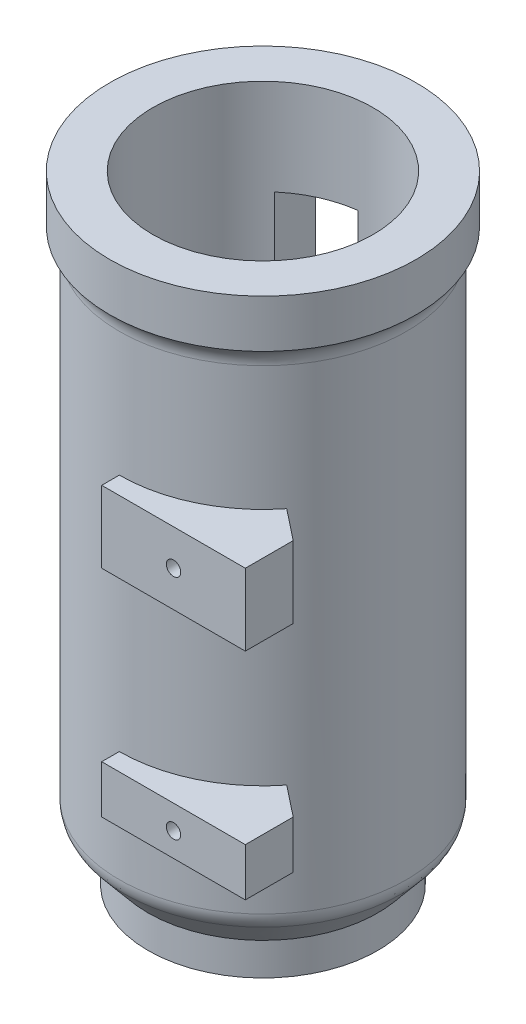
ISO-10303-21;
HEADER;
FILE_DESCRIPTION(('STEP AP214'),'2;1');
FILE_NAME('part.step','',(''),(''),'','','');
FILE_SCHEMA(('AUTOMOTIVE_DESIGN { 1 0 10303 214 1 1 1 1 }'));
ENDSEC;
DATA;
#1=APPLICATION_CONTEXT('core data for automotive mechanical design processes');
#2=APPLICATION_PROTOCOL_DEFINITION('international standard','automotive_design',2000,#1);
#3=PRODUCT_CONTEXT('',#1,'mechanical');
#4=PRODUCT('Part','Part','',(#3));
#5=PRODUCT_RELATED_PRODUCT_CATEGORY('part','',(#4));
#6=PRODUCT_DEFINITION_FORMATION('','',#4);
#7=PRODUCT_DEFINITION_CONTEXT('part definition',#1,'design');
#8=PRODUCT_DEFINITION('design','',#6,#7);
#9=PRODUCT_DEFINITION_SHAPE('','',#8);
#10=(LENGTH_UNIT() NAMED_UNIT(*) SI_UNIT(.MILLI.,.METRE.));
#11=(NAMED_UNIT(*) PLANE_ANGLE_UNIT() SI_UNIT($,.RADIAN.));
#12=(NAMED_UNIT(*) SI_UNIT($,.STERADIAN.) SOLID_ANGLE_UNIT());
#13=UNCERTAINTY_MEASURE_WITH_UNIT(LENGTH_MEASURE(1.E-05),#10,'distance_accuracy_value','');
#14=(GEOMETRIC_REPRESENTATION_CONTEXT(3) GLOBAL_UNCERTAINTY_ASSIGNED_CONTEXT((#13)) GLOBAL_UNIT_ASSIGNED_CONTEXT((#10,
#11,#12)) REPRESENTATION_CONTEXT('',''));
#15=CARTESIAN_POINT('',(0.,0.,0.));
#16=DIRECTION('',(0.,0.,1.));
#17=DIRECTION('',(1.,0.,0.));
#18=AXIS2_PLACEMENT_3D('',#15,#16,#17);
#19=CARTESIAN_POINT('',(0.,114.,0.));
#20=DIRECTION('',(0.,-1.,0.));
#21=DIRECTION('',(0.,0.,-1.));
#22=AXIS2_PLACEMENT_3D('',#19,#20,#21);
#23=CYLINDRICAL_SURFACE('',#22,30.);
#24=DIRECTION('',(0.,-1.,0.));
#25=VECTOR('',#24,1.);
#26=CARTESIAN_POINT('',(0.,34.,30.));
#27=LINE('',#26,#25);
#28=CARTESIAN_POINT('',(0.,34.,30.));
#29=VERTEX_POINT('',#28);
#30=CARTESIAN_POINT('',(0.,24.,30.));
#31=VERTEX_POINT('',#30);
#32=EDGE_CURVE('E56',#29,#31,#27,.T.);
#33=ORIENTED_EDGE('',*,*,#32,.F.);
#34=CARTESIAN_POINT('',(0.,34.,0.));
#35=DIRECTION('',(0.,-1.,0.));
#36=DIRECTION('',(0.,0.,1.));
#37=AXIS2_PLACEMENT_3D('',#34,#35,#36);
#38=CIRCLE('',#37,30.);
#39=CARTESIAN_POINT('',(23.5497514520521,34.,18.5851878265076));
#40=VERTEX_POINT('',#39);
#41=EDGE_CURVE('E51',#40,#29,#38,.T.);
#42=ORIENTED_EDGE('',*,*,#41,.F.);
#43=DIRECTION('',(0.,-1.,0.));
#44=VECTOR('',#43,1.);
#45=CARTESIAN_POINT('',(23.5497514520521,34.,18.5851878265076));
#46=LINE('',#45,#44);
#47=CARTESIAN_POINT('',(23.5497514520521,24.,18.5851878265076));
#48=VERTEX_POINT('',#47);
#49=EDGE_CURVE('E142',#40,#48,#46,.T.);
#50=ORIENTED_EDGE('',*,*,#49,.T.);
#51=CARTESIAN_POINT('',(0.,24.,0.));
#52=DIRECTION('',(0.,-1.,0.));
#53=DIRECTION('',(0.,0.,1.));
#54=AXIS2_PLACEMENT_3D('',#51,#52,#53);
#55=CIRCLE('',#54,30.);
#56=EDGE_CURVE('E421',#48,#31,#55,.T.);
#57=ORIENTED_EDGE('',*,*,#56,.T.);
#58=EDGE_LOOP('',(#33,#42,#50,#57));
#59=FACE_BOUND('',#58,.T.);
#60=CARTESIAN_POINT('',(0.,10.8102496759067,0.));
#61=DIRECTION('',(0.,-1.,0.));
#62=DIRECTION('',(0.,0.,-1.));
#63=AXIS2_PLACEMENT_3D('',#60,#61,#62);
#64=CIRCLE('',#63,30.);
#65=CARTESIAN_POINT('',(0.,10.8102496759067,-30.));
#66=VERTEX_POINT('',#65);
#67=EDGE_CURVE('E240',#66,#66,#64,.F.);
#68=ORIENTED_EDGE('',*,*,#67,.T.);
#69=EDGE_LOOP('',(#68));
#70=FACE_BOUND('',#69,.T.);
#71=CARTESIAN_POINT('',(0.,110.,0.));
#72=DIRECTION('',(0.,1.,0.));
#73=DIRECTION('',(0.,0.,1.));
#74=AXIS2_PLACEMENT_3D('',#71,#72,#73);
#75=CIRCLE('',#74,30.);
#76=CARTESIAN_POINT('',(0.,110.,30.));
#77=VERTEX_POINT('',#76);
#78=EDGE_CURVE('E247',#77,#77,#75,.F.);
#79=ORIENTED_EDGE('',*,*,#78,.T.);
#80=EDGE_LOOP('',(#79));
#81=FACE_BOUND('',#80,.T.);
#82=CARTESIAN_POINT('',(0.,104.,0.));
#83=DIRECTION('',(0.,1.,0.));
#84=DIRECTION('',(0.,0.,1.));
#85=AXIS2_PLACEMENT_3D('',#82,#83,#84);
#86=CIRCLE('',#85,30.);
#87=CARTESIAN_POINT('',(-3.,104.,-29.8496231131986));
#88=VERTEX_POINT('',#87);
#89=CARTESIAN_POINT('',(-15.,104.,-25.9807621135332));
#90=VERTEX_POINT('',#89);
#91=EDGE_CURVE('E220',#88,#90,#86,.T.);
#92=ORIENTED_EDGE('',*,*,#91,.T.);
#93=DIRECTION('',(0.,-1.,0.));
#94=VECTOR('',#93,1.);
#95=CARTESIAN_POINT('',(-15.,114.,-25.9807621135332));
#96=LINE('',#95,#94);
#97=CARTESIAN_POINT('',(-15.,64.,-25.9807621135332));
#98=VERTEX_POINT('',#97);
#99=EDGE_CURVE('E223',#90,#98,#96,.T.);
#100=ORIENTED_EDGE('',*,*,#99,.T.);
#101=CARTESIAN_POINT('',(0.,64.,0.));
#102=DIRECTION('',(0.,-1.,0.));
#103=DIRECTION('',(0.,0.,-1.));
#104=AXIS2_PLACEMENT_3D('',#101,#102,#103);
#105=CIRCLE('',#104,30.);
#106=CARTESIAN_POINT('',(-2.99999999999999,64.,-29.8496231131986));
#107=VERTEX_POINT('',#106);
#108=EDGE_CURVE('E207',#98,#107,#105,.T.);
#109=ORIENTED_EDGE('',*,*,#108,.T.);
#110=DIRECTION('',(0.,-1.,0.));
#111=VECTOR('',#110,1.);
#112=CARTESIAN_POINT('',(-3.,114.,-29.8496231131986));
#113=LINE('',#112,#111);
#114=EDGE_CURVE('E217',#107,#88,#113,.F.);
#115=ORIENTED_EDGE('',*,*,#114,.T.);
#116=EDGE_LOOP('',(#92,#100,#109,#115));
#117=FACE_BOUND('',#116,.T.);
#118=CARTESIAN_POINT('',(0.,69.,0.));
#119=DIRECTION('',(0.,-1.,0.));
#120=DIRECTION('',(0.,0.,1.));
#121=AXIS2_PLACEMENT_3D('',#118,#119,#120);
#122=CIRCLE('',#121,30.);
#123=CARTESIAN_POINT('',(23.5497514520521,69.,18.5851878265076));
#124=VERTEX_POINT('',#123);
#125=CARTESIAN_POINT('',(0.,69.,30.));
#126=VERTEX_POINT('',#125);
#127=EDGE_CURVE('E168',#124,#126,#122,.T.);
#128=ORIENTED_EDGE('',*,*,#127,.T.);
#129=DIRECTION('',(0.,1.,0.));
#130=VECTOR('',#129,1.);
#131=CARTESIAN_POINT('',(0.,69.,30.));
#132=LINE('',#131,#130);
#133=CARTESIAN_POINT('',(0.,84.,30.));
#134=VERTEX_POINT('',#133);
#135=EDGE_CURVE('E199',#126,#134,#132,.T.);
#136=ORIENTED_EDGE('',*,*,#135,.T.);
#137=CARTESIAN_POINT('',(0.,84.,0.));
#138=DIRECTION('',(0.,-1.,0.));
#139=DIRECTION('',(0.,0.,1.));
#140=AXIS2_PLACEMENT_3D('',#137,#138,#139);
#141=CIRCLE('',#140,30.);
#142=CARTESIAN_POINT('',(23.5497514520521,84.,18.5851878265076));
#143=VERTEX_POINT('',#142);
#144=EDGE_CURVE('E160',#143,#134,#141,.T.);
#145=ORIENTED_EDGE('',*,*,#144,.F.);
#146=DIRECTION('',(0.,1.,0.));
#147=VECTOR('',#146,1.);
#148=CARTESIAN_POINT('',(23.5497514520521,69.,18.5851878265076));
#149=LINE('',#148,#147);
#150=EDGE_CURVE('E180',#124,#143,#149,.T.);
#151=ORIENTED_EDGE('',*,*,#150,.F.);
#152=EDGE_LOOP('',(#128,#136,#145,#151));
#153=FACE_BOUND('',#152,.T.);
#154=ADVANCED_FACE('F36',(#59,#70,#81,#117,#153),#23,.T.);
#155=CARTESIAN_POINT('',(0.,0.,0.));
#156=DIRECTION('',(0.,1.,0.));
#157=DIRECTION('',(0.,0.,1.));
#158=AXIS2_PLACEMENT_3D('',#155,#156,#157);
#159=CONICAL_SURFACE('',#158,22.5,0.694738276196703);
#160=CARTESIAN_POINT('',(0.,7.60932767758425,0.));
#161=DIRECTION('',(0.,1.,0.));
#162=DIRECTION('',(0.,0.,1.));
#163=AXIS2_PLACEMENT_3D('',#160,#161,#162);
#164=CIRCLE('',#163,28.8411063979869);
#165=CARTESIAN_POINT('',(0.,7.60932767758425,28.8411063979869));
#166=VERTEX_POINT('',#165);
#167=EDGE_CURVE('E250',#166,#166,#164,.F.);
#168=ORIENTED_EDGE('',*,*,#167,.T.);
#169=EDGE_LOOP('',(#168));
#170=FACE_BOUND('',#169,.T.);
#171=CARTESIAN_POINT('',(0.,1.8,0.));
#172=DIRECTION('',(0.,1.,0.));
#173=DIRECTION('',(0.,0.,1.));
#174=AXIS2_PLACEMENT_3D('',#171,#172,#173);
#175=CIRCLE('',#174,24.);
#176=CARTESIAN_POINT('',(0.,1.8,24.));
#177=VERTEX_POINT('',#176);
#178=EDGE_CURVE('E232',#177,#177,#175,.T.);
#179=ORIENTED_EDGE('',*,*,#178,.T.);
#180=EDGE_LOOP('',(#179));
#181=FACE_BOUND('',#180,.T.);
#182=ADVANCED_FACE('F290',(#170,#181),#159,.T.);
#183=CARTESIAN_POINT('',(0.,124.,0.));
#184=DIRECTION('',(0.,-1.,0.));
#185=DIRECTION('',(0.,0.,-1.));
#186=AXIS2_PLACEMENT_3D('',#183,#184,#185);
#187=CYLINDRICAL_SURFACE('',#186,32.);
#188=CARTESIAN_POINT('',(0.,124.,0.));
#189=DIRECTION('',(0.,1.,0.));
#190=DIRECTION('',(0.,0.,1.));
#191=AXIS2_PLACEMENT_3D('',#188,#189,#190);
#192=CIRCLE('',#191,32.);
#193=CARTESIAN_POINT('',(0.,124.,32.));
#194=VERTEX_POINT('',#193);
#195=EDGE_CURVE('E237',#194,#194,#192,.T.);
#196=ORIENTED_EDGE('',*,*,#195,.F.);
#197=EDGE_LOOP('',(#196));
#198=FACE_BOUND('',#197,.T.);
#199=CARTESIAN_POINT('',(0.,114.,0.));
#200=DIRECTION('',(0.,1.,0.));
#201=DIRECTION('',(0.,0.,1.));
#202=AXIS2_PLACEMENT_3D('',#199,#200,#201);
#203=CIRCLE('',#202,32.);
#204=CARTESIAN_POINT('',(0.,114.,32.));
#205=VERTEX_POINT('',#204);
#206=EDGE_CURVE('E236',#205,#205,#203,.T.);
#207=ORIENTED_EDGE('',*,*,#206,.T.);
#208=EDGE_LOOP('',(#207));
#209=FACE_BOUND('',#208,.T.);
#210=ADVANCED_FACE('F297',(#198,#209),#187,.T.);
#211=CARTESIAN_POINT('',(0.,124.,0.));
#212=DIRECTION('',(0.,1.,0.));
#213=DIRECTION('',(0.,0.,1.));
#214=AXIS2_PLACEMENT_3D('',#211,#212,#213);
#215=PLANE('',#214);
#216=CARTESIAN_POINT('',(0.,124.,0.));
#217=DIRECTION('',(0.,1.,0.));
#218=DIRECTION('',(0.,0.,1.));
#219=AXIS2_PLACEMENT_3D('',#216,#217,#218);
#220=CIRCLE('',#219,23.);
#221=CARTESIAN_POINT('',(0.,124.,23.));
#222=VERTEX_POINT('',#221);
#223=EDGE_CURVE('E233',#222,#222,#220,.T.);
#224=ORIENTED_EDGE('',*,*,#223,.F.);
#225=EDGE_LOOP('',(#224));
#226=FACE_BOUND('',#225,.T.);
#227=ORIENTED_EDGE('',*,*,#195,.T.);
#228=EDGE_LOOP('',(#227));
#229=FACE_BOUND('',#228,.T.);
#230=ADVANCED_FACE('F320',(#226,#229),#215,.T.);
#231=CARTESIAN_POINT('',(0.,-37.,0.));
#232=DIRECTION('',(0.,1.,0.));
#233=DIRECTION('',(0.,0.,1.));
#234=AXIS2_PLACEMENT_3D('',#231,#232,#233);
#235=CYLINDRICAL_SURFACE('',#234,23.);
#236=CARTESIAN_POINT('',(0.,64.,0.));
#237=DIRECTION('',(0.,-1.,0.));
#238=DIRECTION('',(0.,0.,-1.));
#239=AXIS2_PLACEMENT_3D('',#236,#237,#238);
#240=CIRCLE('',#239,23.);
#241=CARTESIAN_POINT('',(-2.99999999999999,64.,-22.8035085019828));
#242=VERTEX_POINT('',#241);
#243=CARTESIAN_POINT('',(-15.,64.,-17.4355957741627));
#244=VERTEX_POINT('',#243);
#245=EDGE_CURVE('E253',#242,#244,#240,.F.);
#246=ORIENTED_EDGE('',*,*,#245,.T.);
#247=DIRECTION('',(0.,1.,0.));
#248=VECTOR('',#247,1.);
#249=CARTESIAN_POINT('',(-15.,-37.,-17.4355957741627));
#250=LINE('',#249,#248);
#251=CARTESIAN_POINT('',(-15.,104.,-17.4355957741627));
#252=VERTEX_POINT('',#251);
#253=EDGE_CURVE('E12',#244,#252,#250,.T.);
#254=ORIENTED_EDGE('',*,*,#253,.T.);
#255=CARTESIAN_POINT('',(0.,104.,0.));
#256=DIRECTION('',(0.,1.,0.));
#257=DIRECTION('',(0.,0.,1.));
#258=AXIS2_PLACEMENT_3D('',#255,#256,#257);
#259=CIRCLE('',#258,23.);
#260=CARTESIAN_POINT('',(-3.,104.,-22.8035085019828));
#261=VERTEX_POINT('',#260);
#262=EDGE_CURVE('E44',#252,#261,#259,.F.);
#263=ORIENTED_EDGE('',*,*,#262,.T.);
#264=DIRECTION('',(0.,1.,0.));
#265=VECTOR('',#264,1.);
#266=CARTESIAN_POINT('',(-2.99999999999998,-37.,-22.8035085019828));
#267=LINE('',#266,#265);
#268=EDGE_CURVE('E256',#261,#242,#267,.F.);
#269=ORIENTED_EDGE('',*,*,#268,.T.);
#270=EDGE_LOOP('',(#246,#254,#263,#269));
#271=FACE_BOUND('',#270,.T.);
#272=ORIENTED_EDGE('',*,*,#223,.T.);
#273=EDGE_LOOP('',(#272));
#274=FACE_BOUND('',#273,.T.);
#275=CARTESIAN_POINT('',(0.,-5.,0.));
#276=DIRECTION('',(0.,1.,0.));
#277=DIRECTION('',(0.,0.,1.));
#278=AXIS2_PLACEMENT_3D('',#275,#276,#277);
#279=CIRCLE('',#278,23.);
#280=CARTESIAN_POINT('',(0.,-5.,23.));
#281=VERTEX_POINT('',#280);
#282=EDGE_CURVE('E226',#281,#281,#279,.T.);
#283=ORIENTED_EDGE('',*,*,#282,.F.);
#284=EDGE_LOOP('',(#283));
#285=FACE_BOUND('',#284,.T.);
#286=ADVANCED_FACE('F260',(#271,#274,#285),#235,.F.);
#287=CARTESIAN_POINT('',(0.,3.,0.));
#288=DIRECTION('',(0.,-1.,0.));
#289=DIRECTION('',(0.,0.,-1.));
#290=AXIS2_PLACEMENT_3D('',#287,#288,#289);
#291=CYLINDRICAL_SURFACE('',#290,24.);
#292=ORIENTED_EDGE('',*,*,#178,.F.);
#293=EDGE_LOOP('',(#292));
#294=FACE_BOUND('',#293,.T.);
#295=CARTESIAN_POINT('',(0.,-5.,0.));
#296=DIRECTION('',(0.,1.,0.));
#297=DIRECTION('',(0.,0.,1.));
#298=AXIS2_PLACEMENT_3D('',#295,#296,#297);
#299=CIRCLE('',#298,24.);
#300=CARTESIAN_POINT('',(0.,-5.,24.));
#301=VERTEX_POINT('',#300);
#302=EDGE_CURVE('E229',#301,#301,#299,.T.);
#303=ORIENTED_EDGE('',*,*,#302,.T.);
#304=EDGE_LOOP('',(#303));
#305=FACE_BOUND('',#304,.T.);
#306=ADVANCED_FACE('F312',(#294,#305),#291,.T.);
#307=CARTESIAN_POINT('',(0.,-5.,0.));
#308=DIRECTION('',(0.,1.,0.));
#309=DIRECTION('',(0.,0.,1.));
#310=AXIS2_PLACEMENT_3D('',#307,#308,#309);
#311=PLANE('',#310);
#312=ORIENTED_EDGE('',*,*,#282,.T.);
#313=EDGE_LOOP('',(#312));
#314=FACE_BOUND('',#313,.T.);
#315=ORIENTED_EDGE('',*,*,#302,.F.);
#316=EDGE_LOOP('',(#315));
#317=FACE_BOUND('',#316,.T.);
#318=ADVANCED_FACE('F305',(#314,#317),#311,.F.);
#319=CARTESIAN_POINT('',(0.,110.,0.));
#320=DIRECTION('',(0.,1.,0.));
#321=DIRECTION('',(0.,0.,1.));
#322=AXIS2_PLACEMENT_3D('',#319,#320,#321);
#323=TOROIDAL_SURFACE('',#322,35.,5.);
#324=ORIENTED_EDGE('',*,*,#78,.F.);
#325=EDGE_LOOP('',(#324));
#326=FACE_BOUND('',#325,.T.);
#327=ORIENTED_EDGE('',*,*,#206,.F.);
#328=EDGE_LOOP('',(#327));
#329=FACE_BOUND('',#328,.T.);
#330=ADVANCED_FACE('F303',(#326,#329),#323,.F.);
#331=CARTESIAN_POINT('',(0.,10.8102496759067,0.));
#332=DIRECTION('',(0.,-1.,0.));
#333=DIRECTION('',(0.,0.,-1.));
#334=AXIS2_PLACEMENT_3D('',#331,#332,#333);
#335=TOROIDAL_SURFACE('',#334,25.,5.);
#336=ORIENTED_EDGE('',*,*,#167,.F.);
#337=EDGE_LOOP('',(#336));
#338=FACE_BOUND('',#337,.T.);
#339=ORIENTED_EDGE('',*,*,#67,.F.);
#340=EDGE_LOOP('',(#339));
#341=FACE_BOUND('',#340,.T.);
#342=ADVANCED_FACE('F38',(#338,#341),#335,.T.);
#343=CARTESIAN_POINT('',(-15.,104.,-525.));
#344=DIRECTION('',(-1.,0.,0.));
#345=DIRECTION('',(0.,-1.,0.));
#346=AXIS2_PLACEMENT_3D('',#343,#344,#345);
#347=PLANE('',#346);
#348=DIRECTION('',(0.,0.,1.));
#349=VECTOR('',#348,1.);
#350=CARTESIAN_POINT('',(-15.,104.,-525.));
#351=LINE('',#350,#349);
#352=EDGE_CURVE('E204',#90,#252,#351,.T.);
#353=ORIENTED_EDGE('',*,*,#352,.T.);
#354=ORIENTED_EDGE('',*,*,#253,.F.);
#355=DIRECTION('',(0.,0.,1.));
#356=VECTOR('',#355,1.);
#357=CARTESIAN_POINT('',(-15.,64.,-525.));
#358=LINE('',#357,#356);
#359=EDGE_CURVE('E194',#98,#244,#358,.T.);
#360=ORIENTED_EDGE('',*,*,#359,.F.);
#361=ORIENTED_EDGE('',*,*,#99,.F.);
#362=EDGE_LOOP('',(#353,#354,#360,#361));
#363=FACE_BOUND('',#362,.T.);
#364=ADVANCED_FACE('F268',(#363),#347,.F.);
#365=CARTESIAN_POINT('',(-15.,104.,-525.));
#366=DIRECTION('',(0.,1.,0.));
#367=DIRECTION('',(0.,0.,1.));
#368=AXIS2_PLACEMENT_3D('',#365,#366,#367);
#369=PLANE('',#368);
#370=DIRECTION('',(0.,0.,1.));
#371=VECTOR('',#370,1.);
#372=CARTESIAN_POINT('',(-3.,104.,-525.));
#373=LINE('',#372,#371);
#374=EDGE_CURVE('E208',#88,#261,#373,.T.);
#375=ORIENTED_EDGE('',*,*,#374,.T.);
#376=ORIENTED_EDGE('',*,*,#262,.F.);
#377=ORIENTED_EDGE('',*,*,#352,.F.);
#378=ORIENTED_EDGE('',*,*,#91,.F.);
#379=EDGE_LOOP('',(#375,#376,#377,#378));
#380=FACE_BOUND('',#379,.T.);
#381=ADVANCED_FACE('F265',(#380),#369,.F.);
#382=CARTESIAN_POINT('',(-3.,104.,-525.));
#383=DIRECTION('',(1.,0.,0.));
#384=DIRECTION('',(0.,1.,0.));
#385=AXIS2_PLACEMENT_3D('',#382,#383,#384);
#386=PLANE('',#385);
#387=DIRECTION('',(0.,0.,1.));
#388=VECTOR('',#387,1.);
#389=CARTESIAN_POINT('',(-2.99999999999999,64.,-525.));
#390=LINE('',#389,#388);
#391=EDGE_CURVE('E211',#107,#242,#390,.T.);
#392=ORIENTED_EDGE('',*,*,#391,.T.);
#393=ORIENTED_EDGE('',*,*,#268,.F.);
#394=ORIENTED_EDGE('',*,*,#374,.F.);
#395=ORIENTED_EDGE('',*,*,#114,.F.);
#396=EDGE_LOOP('',(#392,#393,#394,#395));
#397=FACE_BOUND('',#396,.T.);
#398=ADVANCED_FACE('F274',(#397),#386,.F.);
#399=CARTESIAN_POINT('',(-15.,64.,-525.));
#400=DIRECTION('',(0.,-1.,0.));
#401=DIRECTION('',(0.,0.,-1.));
#402=AXIS2_PLACEMENT_3D('',#399,#400,#401);
#403=PLANE('',#402);
#404=ORIENTED_EDGE('',*,*,#359,.T.);
#405=ORIENTED_EDGE('',*,*,#245,.F.);
#406=ORIENTED_EDGE('',*,*,#391,.F.);
#407=ORIENTED_EDGE('',*,*,#108,.F.);
#408=EDGE_LOOP('',(#404,#405,#406,#407));
#409=FACE_BOUND('',#408,.T.);
#410=ADVANCED_FACE('F276',(#409),#403,.F.);
#411=CARTESIAN_POINT('',(30.,69.,23.6756483791528));
#412=DIRECTION('',(0.619506260883588,0.,-0.784991715068405));
#413=DIRECTION('',(-0.784991715068405,0.,-0.619506260883588));
#414=AXIS2_PLACEMENT_3D('',#411,#412,#413);
#415=PLANE('',#414);
#416=DIRECTION('',(-0.784991715068405,0.,-0.619506260883588));
#417=VECTOR('',#416,1.);
#418=CARTESIAN_POINT('',(30.,84.,23.6756483791528));
#419=LINE('',#418,#417);
#420=CARTESIAN_POINT('',(30.,84.,23.6756483791528));
#421=VERTEX_POINT('',#420);
#422=EDGE_CURVE('E158',#421,#143,#419,.T.);
#423=ORIENTED_EDGE('',*,*,#422,.F.);
#424=DIRECTION('',(0.,1.,0.));
#425=VECTOR('',#424,1.);
#426=CARTESIAN_POINT('',(30.,69.,23.6756483791528));
#427=LINE('',#426,#425);
#428=CARTESIAN_POINT('',(30.,69.,23.6756483791528));
#429=VERTEX_POINT('',#428);
#430=EDGE_CURVE('E192',#429,#421,#427,.T.);
#431=ORIENTED_EDGE('',*,*,#430,.F.);
#432=DIRECTION('',(-0.784991715068405,0.,-0.619506260883588));
#433=VECTOR('',#432,1.);
#434=CARTESIAN_POINT('',(30.,69.,23.6756483791528));
#435=LINE('',#434,#433);
#436=EDGE_CURVE('E165',#429,#124,#435,.T.);
#437=ORIENTED_EDGE('',*,*,#436,.T.);
#438=ORIENTED_EDGE('',*,*,#150,.T.);
#439=EDGE_LOOP('',(#423,#431,#437,#438));
#440=FACE_BOUND('',#439,.T.);
#441=ADVANCED_FACE('F278',(#440),#415,.T.);
#442=CARTESIAN_POINT('',(30.,69.,33.6756483791528));
#443=DIRECTION('',(1.,0.,0.));
#444=DIRECTION('',(0.,0.,-1.));
#445=AXIS2_PLACEMENT_3D('',#442,#443,#444);
#446=PLANE('',#445);
#447=DIRECTION('',(0.,0.,-1.));
#448=VECTOR('',#447,1.);
#449=CARTESIAN_POINT('',(30.,84.,33.6756483791528));
#450=LINE('',#449,#448);
#451=CARTESIAN_POINT('',(30.,84.,33.6756483791528));
#452=VERTEX_POINT('',#451);
#453=EDGE_CURVE('E169',#452,#421,#450,.T.);
#454=ORIENTED_EDGE('',*,*,#453,.F.);
#455=DIRECTION('',(0.,1.,0.));
#456=VECTOR('',#455,1.);
#457=CARTESIAN_POINT('',(30.,69.,33.6756483791528));
#458=LINE('',#457,#456);
#459=CARTESIAN_POINT('',(30.,69.,33.6756483791528));
#460=VERTEX_POINT('',#459);
#461=EDGE_CURVE('E195',#460,#452,#458,.T.);
#462=ORIENTED_EDGE('',*,*,#461,.F.);
#463=DIRECTION('',(0.,0.,-1.));
#464=VECTOR('',#463,1.);
#465=CARTESIAN_POINT('',(30.,69.,33.6756483791528));
#466=LINE('',#465,#464);
#467=EDGE_CURVE('E178',#460,#429,#466,.T.);
#468=ORIENTED_EDGE('',*,*,#467,.T.);
#469=ORIENTED_EDGE('',*,*,#430,.T.);
#470=EDGE_LOOP('',(#454,#462,#468,#469));
#471=FACE_BOUND('',#470,.T.);
#472=ADVANCED_FACE('F284',(#471),#446,.T.);
#473=CARTESIAN_POINT('',(0.,69.,33.6756483791528));
#474=DIRECTION('',(0.,0.,1.));
#475=DIRECTION('',(1.,0.,0.));
#476=AXIS2_PLACEMENT_3D('',#473,#474,#475);
#477=PLANE('',#476);
#478=CARTESIAN_POINT('',(15.,76.5,33.6756483791528));
#479=DIRECTION('',(0.,0.,1.));
#480=DIRECTION('',(1.,0.,0.));
#481=AXIS2_PLACEMENT_3D('',#478,#479,#480);
#482=CIRCLE('',#481,1.5);
#483=CARTESIAN_POINT('',(16.5,76.5,33.6756483791528));
#484=VERTEX_POINT('',#483);
#485=EDGE_CURVE('E412',#484,#484,#482,.T.);
#486=ORIENTED_EDGE('',*,*,#485,.F.);
#487=EDGE_LOOP('',(#486));
#488=FACE_BOUND('',#487,.T.);
#489=DIRECTION('',(1.,0.,0.));
#490=VECTOR('',#489,1.);
#491=CARTESIAN_POINT('',(0.,84.,33.6756483791528));
#492=LINE('',#491,#490);
#493=CARTESIAN_POINT('',(0.,84.,33.6756483791528));
#494=VERTEX_POINT('',#493);
#495=EDGE_CURVE('E187',#494,#452,#492,.T.);
#496=ORIENTED_EDGE('',*,*,#495,.F.);
#497=DIRECTION('',(0.,1.,0.));
#498=VECTOR('',#497,1.);
#499=CARTESIAN_POINT('',(0.,69.,33.6756483791528));
#500=LINE('',#499,#498);
#501=CARTESIAN_POINT('',(0.,69.,33.6756483791528));
#502=VERTEX_POINT('',#501);
#503=EDGE_CURVE('E197',#502,#494,#500,.T.);
#504=ORIENTED_EDGE('',*,*,#503,.F.);
#505=DIRECTION('',(1.,0.,0.));
#506=VECTOR('',#505,1.);
#507=CARTESIAN_POINT('',(0.,69.,33.6756483791528));
#508=LINE('',#507,#506);
#509=EDGE_CURVE('E175',#502,#460,#508,.T.);
#510=ORIENTED_EDGE('',*,*,#509,.T.);
#511=ORIENTED_EDGE('',*,*,#461,.T.);
#512=EDGE_LOOP('',(#496,#504,#510,#511));
#513=FACE_BOUND('',#512,.T.);
#514=ADVANCED_FACE('F349',(#488,#513),#477,.T.);
#515=CARTESIAN_POINT('',(0.,69.,30.));
#516=DIRECTION('',(-1.,0.,0.));
#517=DIRECTION('',(0.,0.,1.));
#518=AXIS2_PLACEMENT_3D('',#515,#516,#517);
#519=PLANE('',#518);
#520=DIRECTION('',(0.,0.,1.));
#521=VECTOR('',#520,1.);
#522=CARTESIAN_POINT('',(0.,84.,30.));
#523=LINE('',#522,#521);
#524=EDGE_CURVE('E184',#134,#494,#523,.T.);
#525=ORIENTED_EDGE('',*,*,#524,.F.);
#526=ORIENTED_EDGE('',*,*,#135,.F.);
#527=DIRECTION('',(0.,0.,1.));
#528=VECTOR('',#527,1.);
#529=CARTESIAN_POINT('',(0.,69.,30.));
#530=LINE('',#529,#528);
#531=EDGE_CURVE('E172',#126,#502,#530,.T.);
#532=ORIENTED_EDGE('',*,*,#531,.T.);
#533=ORIENTED_EDGE('',*,*,#503,.T.);
#534=EDGE_LOOP('',(#525,#526,#532,#533));
#535=FACE_BOUND('',#534,.T.);
#536=ADVANCED_FACE('F345',(#535),#519,.T.);
#537=CARTESIAN_POINT('',(0.,69.,0.));
#538=DIRECTION('',(0.,1.,0.));
#539=DIRECTION('',(0.,0.,1.));
#540=AXIS2_PLACEMENT_3D('',#537,#538,#539);
#541=PLANE('',#540);
#542=ORIENTED_EDGE('',*,*,#436,.F.);
#543=ORIENTED_EDGE('',*,*,#467,.F.);
#544=ORIENTED_EDGE('',*,*,#509,.F.);
#545=ORIENTED_EDGE('',*,*,#531,.F.);
#546=ORIENTED_EDGE('',*,*,#127,.F.);
#547=EDGE_LOOP('',(#542,#543,#544,#545,#546));
#548=FACE_BOUND('',#547,.T.);
#549=ADVANCED_FACE('F348',(#548),#541,.F.);
#550=CARTESIAN_POINT('',(0.,84.,0.));
#551=DIRECTION('',(0.,1.,0.));
#552=DIRECTION('',(0.,0.,1.));
#553=AXIS2_PLACEMENT_3D('',#550,#551,#552);
#554=PLANE('',#553);
#555=ORIENTED_EDGE('',*,*,#422,.T.);
#556=ORIENTED_EDGE('',*,*,#144,.T.);
#557=ORIENTED_EDGE('',*,*,#524,.T.);
#558=ORIENTED_EDGE('',*,*,#495,.T.);
#559=ORIENTED_EDGE('',*,*,#453,.T.);
#560=EDGE_LOOP('',(#555,#556,#557,#558,#559));
#561=FACE_BOUND('',#560,.T.);
#562=ADVANCED_FACE('F357',(#561),#554,.T.);
#563=CARTESIAN_POINT('',(30.,34.,33.6756483791528));
#564=DIRECTION('',(-1.,0.,0.));
#565=DIRECTION('',(0.,0.,1.));
#566=AXIS2_PLACEMENT_3D('',#563,#564,#565);
#567=PLANE('',#566);
#568=DIRECTION('',(0.,0.,-1.));
#569=VECTOR('',#568,1.);
#570=CARTESIAN_POINT('',(30.,24.,33.6756483791528));
#571=LINE('',#570,#569);
#572=CARTESIAN_POINT('',(30.,24.,33.6756483791528));
#573=VERTEX_POINT('',#572);
#574=CARTESIAN_POINT('',(30.,24.,23.6756483791528));
#575=VERTEX_POINT('',#574);
#576=EDGE_CURVE('E157',#573,#575,#571,.T.);
#577=ORIENTED_EDGE('',*,*,#576,.T.);
#578=DIRECTION('',(0.,-1.,0.));
#579=VECTOR('',#578,1.);
#580=CARTESIAN_POINT('',(30.,34.,23.6756483791528));
#581=LINE('',#580,#579);
#582=CARTESIAN_POINT('',(30.,34.,23.6756483791528));
#583=VERTEX_POINT('',#582);
#584=EDGE_CURVE('E140',#583,#575,#581,.T.);
#585=ORIENTED_EDGE('',*,*,#584,.F.);
#586=DIRECTION('',(0.,0.,-1.));
#587=VECTOR('',#586,1.);
#588=CARTESIAN_POINT('',(30.,34.,33.6756483791528));
#589=LINE('',#588,#587);
#590=CARTESIAN_POINT('',(30.,34.,33.6756483791528));
#591=VERTEX_POINT('',#590);
#592=EDGE_CURVE('E144',#591,#583,#589,.T.);
#593=ORIENTED_EDGE('',*,*,#592,.F.);
#594=DIRECTION('',(0.,-1.,0.));
#595=VECTOR('',#594,1.);
#596=CARTESIAN_POINT('',(30.,34.,33.6756483791528));
#597=LINE('',#596,#595);
#598=EDGE_CURVE('E418',#591,#573,#597,.T.);
#599=ORIENTED_EDGE('',*,*,#598,.T.);
#600=EDGE_LOOP('',(#577,#585,#593,#599));
#601=FACE_BOUND('',#600,.T.);
#602=ADVANCED_FACE('F155',(#601),#567,.F.);
#603=CARTESIAN_POINT('',(30.,34.,23.6756483791528));
#604=DIRECTION('',(-0.619506260883587,0.,0.784991715068405));
#605=DIRECTION('',(0.784991715068405,0.,0.619506260883587));
#606=AXIS2_PLACEMENT_3D('',#603,#604,#605);
#607=PLANE('',#606);
#608=DIRECTION('',(-0.784991715068405,0.,-0.619506260883587));
#609=VECTOR('',#608,1.);
#610=CARTESIAN_POINT('',(30.,24.,23.6756483791528));
#611=LINE('',#610,#609);
#612=EDGE_CURVE('E404',#575,#48,#611,.T.);
#613=ORIENTED_EDGE('',*,*,#612,.T.);
#614=ORIENTED_EDGE('',*,*,#49,.F.);
#615=DIRECTION('',(-0.784991715068405,0.,-0.619506260883587));
#616=VECTOR('',#615,1.);
#617=CARTESIAN_POINT('',(30.,34.,23.6756483791528));
#618=LINE('',#617,#616);
#619=EDGE_CURVE('E135',#583,#40,#618,.T.);
#620=ORIENTED_EDGE('',*,*,#619,.F.);
#621=ORIENTED_EDGE('',*,*,#584,.T.);
#622=EDGE_LOOP('',(#613,#614,#620,#621));
#623=FACE_BOUND('',#622,.T.);
#624=ADVANCED_FACE('F138',(#623),#607,.F.);
#625=CARTESIAN_POINT('',(0.,34.,30.));
#626=DIRECTION('',(1.,0.,0.));
#627=DIRECTION('',(0.,0.,-1.));
#628=AXIS2_PLACEMENT_3D('',#625,#626,#627);
#629=PLANE('',#628);
#630=DIRECTION('',(0.,0.,1.));
#631=VECTOR('',#630,1.);
#632=CARTESIAN_POINT('',(0.,24.,30.));
#633=LINE('',#632,#631);
#634=CARTESIAN_POINT('',(0.,24.,33.6756483791528));
#635=VERTEX_POINT('',#634);
#636=EDGE_CURVE('E423',#31,#635,#633,.T.);
#637=ORIENTED_EDGE('',*,*,#636,.T.);
#638=DIRECTION('',(0.,-1.,0.));
#639=VECTOR('',#638,1.);
#640=CARTESIAN_POINT('',(0.,34.,33.6756483791528));
#641=LINE('',#640,#639);
#642=CARTESIAN_POINT('',(0.,34.,33.6756483791528));
#643=VERTEX_POINT('',#642);
#644=EDGE_CURVE('E427',#643,#635,#641,.T.);
#645=ORIENTED_EDGE('',*,*,#644,.F.);
#646=DIRECTION('',(0.,0.,1.));
#647=VECTOR('',#646,1.);
#648=CARTESIAN_POINT('',(0.,34.,30.));
#649=LINE('',#648,#647);
#650=EDGE_CURVE('E416',#29,#643,#649,.T.);
#651=ORIENTED_EDGE('',*,*,#650,.F.);
#652=ORIENTED_EDGE('',*,*,#32,.T.);
#653=EDGE_LOOP('',(#637,#645,#651,#652));
#654=FACE_BOUND('',#653,.T.);
#655=ADVANCED_FACE('F368',(#654),#629,.F.);
#656=CARTESIAN_POINT('',(0.,34.,33.6756483791528));
#657=DIRECTION('',(0.,0.,-1.));
#658=DIRECTION('',(-1.,0.,0.));
#659=AXIS2_PLACEMENT_3D('',#656,#657,#658);
#660=PLANE('',#659);
#661=CARTESIAN_POINT('',(15.,29.,33.6756483791528));
#662=DIRECTION('',(0.,0.,1.));
#663=DIRECTION('',(1.,0.,0.));
#664=AXIS2_PLACEMENT_3D('',#661,#662,#663);
#665=CIRCLE('',#664,1.49999999999999);
#666=CARTESIAN_POINT('',(16.5,29.,33.6756483791528));
#667=VERTEX_POINT('',#666);
#668=EDGE_CURVE('E402',#667,#667,#665,.T.);
#669=ORIENTED_EDGE('',*,*,#668,.F.);
#670=EDGE_LOOP('',(#669));
#671=FACE_BOUND('',#670,.T.);
#672=DIRECTION('',(1.,0.,0.));
#673=VECTOR('',#672,1.);
#674=CARTESIAN_POINT('',(0.,24.,33.6756483791528));
#675=LINE('',#674,#673);
#676=EDGE_CURVE('E153',#635,#573,#675,.T.);
#677=ORIENTED_EDGE('',*,*,#676,.T.);
#678=ORIENTED_EDGE('',*,*,#598,.F.);
#679=DIRECTION('',(1.,0.,0.));
#680=VECTOR('',#679,1.);
#681=CARTESIAN_POINT('',(0.,34.,33.6756483791528));
#682=LINE('',#681,#680);
#683=EDGE_CURVE('E149',#643,#591,#682,.T.);
#684=ORIENTED_EDGE('',*,*,#683,.F.);
#685=ORIENTED_EDGE('',*,*,#644,.T.);
#686=EDGE_LOOP('',(#677,#678,#684,#685));
#687=FACE_BOUND('',#686,.T.);
#688=ADVANCED_FACE('F371',(#671,#687),#660,.F.);
#689=CARTESIAN_POINT('',(0.,34.,0.));
#690=DIRECTION('',(0.,1.,0.));
#691=DIRECTION('',(0.,0.,1.));
#692=AXIS2_PLACEMENT_3D('',#689,#690,#691);
#693=PLANE('',#692);
#694=ORIENTED_EDGE('',*,*,#592,.T.);
#695=ORIENTED_EDGE('',*,*,#619,.T.);
#696=ORIENTED_EDGE('',*,*,#41,.T.);
#697=ORIENTED_EDGE('',*,*,#650,.T.);
#698=ORIENTED_EDGE('',*,*,#683,.T.);
#699=EDGE_LOOP('',(#694,#695,#696,#697,#698));
#700=FACE_BOUND('',#699,.T.);
#701=ADVANCED_FACE('F147',(#700),#693,.T.);
#702=CARTESIAN_POINT('',(0.,24.,0.));
#703=DIRECTION('',(0.,1.,0.));
#704=DIRECTION('',(0.,0.,1.));
#705=AXIS2_PLACEMENT_3D('',#702,#703,#704);
#706=PLANE('',#705);
#707=ORIENTED_EDGE('',*,*,#576,.F.);
#708=ORIENTED_EDGE('',*,*,#676,.F.);
#709=ORIENTED_EDGE('',*,*,#636,.F.);
#710=ORIENTED_EDGE('',*,*,#56,.F.);
#711=ORIENTED_EDGE('',*,*,#612,.F.);
#712=EDGE_LOOP('',(#707,#708,#709,#710,#711));
#713=FACE_BOUND('',#712,.T.);
#714=ADVANCED_FACE('F376',(#713),#706,.F.);
#715=CARTESIAN_POINT('',(15.,29.,20.6756483791528));
#716=DIRECTION('',(0.,0.,1.));
#717=DIRECTION('',(1.,0.,0.));
#718=AXIS2_PLACEMENT_3D('',#715,#716,#717);
#719=CYLINDRICAL_SURFACE('',#718,1.49999999999999);
#720=CARTESIAN_POINT('',(15.,29.,20.6756483791528));
#721=DIRECTION('',(0.,0.,1.));
#722=DIRECTION('',(1.,0.,0.));
#723=AXIS2_PLACEMENT_3D('',#720,#721,#722);
#724=CIRCLE('',#723,1.49999999999999);
#725=CARTESIAN_POINT('',(16.5,29.,20.6756483791528));
#726=VERTEX_POINT('',#725);
#727=EDGE_CURVE('E401',#726,#726,#724,.T.);
#728=ORIENTED_EDGE('',*,*,#727,.F.);
#729=EDGE_LOOP('',(#728));
#730=FACE_BOUND('',#729,.T.);
#731=ORIENTED_EDGE('',*,*,#668,.T.);
#732=EDGE_LOOP('',(#731));
#733=FACE_BOUND('',#732,.T.);
#734=ADVANCED_FACE('F379',(#730,#733),#719,.F.);
#735=CARTESIAN_POINT('',(15.,29.,20.6756483791528));
#736=DIRECTION('',(0.,0.,1.));
#737=DIRECTION('',(1.,0.,0.));
#738=AXIS2_PLACEMENT_3D('',#735,#736,#737);
#739=PLANE('',#738);
#740=ORIENTED_EDGE('',*,*,#727,.T.);
#741=EDGE_LOOP('',(#740));
#742=FACE_BOUND('',#741,.T.);
#743=ADVANCED_FACE('F387',(#742),#739,.T.);
#744=CARTESIAN_POINT('',(15.,76.5,20.6756483791528));
#745=DIRECTION('',(0.,0.,1.));
#746=DIRECTION('',(1.,0.,0.));
#747=AXIS2_PLACEMENT_3D('',#744,#745,#746);
#748=CYLINDRICAL_SURFACE('',#747,1.5);
#749=CARTESIAN_POINT('',(15.,76.5,20.6756483791528));
#750=DIRECTION('',(0.,0.,1.));
#751=DIRECTION('',(1.,0.,0.));
#752=AXIS2_PLACEMENT_3D('',#749,#750,#751);
#753=CIRCLE('',#752,1.5);
#754=CARTESIAN_POINT('',(16.5,76.5,20.6756483791528));
#755=VERTEX_POINT('',#754);
#756=EDGE_CURVE('E407',#755,#755,#753,.T.);
#757=ORIENTED_EDGE('',*,*,#756,.F.);
#758=EDGE_LOOP('',(#757));
#759=FACE_BOUND('',#758,.T.);
#760=ORIENTED_EDGE('',*,*,#485,.T.);
#761=EDGE_LOOP('',(#760));
#762=FACE_BOUND('',#761,.T.);
#763=ADVANCED_FACE('F383',(#759,#762),#748,.F.);
#764=CARTESIAN_POINT('',(15.,76.5,20.6756483791528));
#765=DIRECTION('',(0.,0.,1.));
#766=DIRECTION('',(1.,0.,0.));
#767=AXIS2_PLACEMENT_3D('',#764,#765,#766);
#768=PLANE('',#767);
#769=ORIENTED_EDGE('',*,*,#756,.T.);
#770=EDGE_LOOP('',(#769));
#771=FACE_BOUND('',#770,.T.);
#772=ADVANCED_FACE('F386',(#771),#768,.T.);
#773=CLOSED_SHELL('',(#154,#182,#210,#230,#286,#306,#318,#330,#342,#364,#381,#398,#410,#441,
#472,#514,#536,#549,#562,#602,#624,#655,#688,#701,#714,#734,#743,#763,#772));
#774=MANIFOLD_SOLID_BREP('B2',#773);
#775=ADVANCED_BREP_SHAPE_REPRESENTATION('',(#18,#774),#14);
#776=SHAPE_DEFINITION_REPRESENTATION(#9,#775);
ENDSEC;
END-ISO-10303-21;
